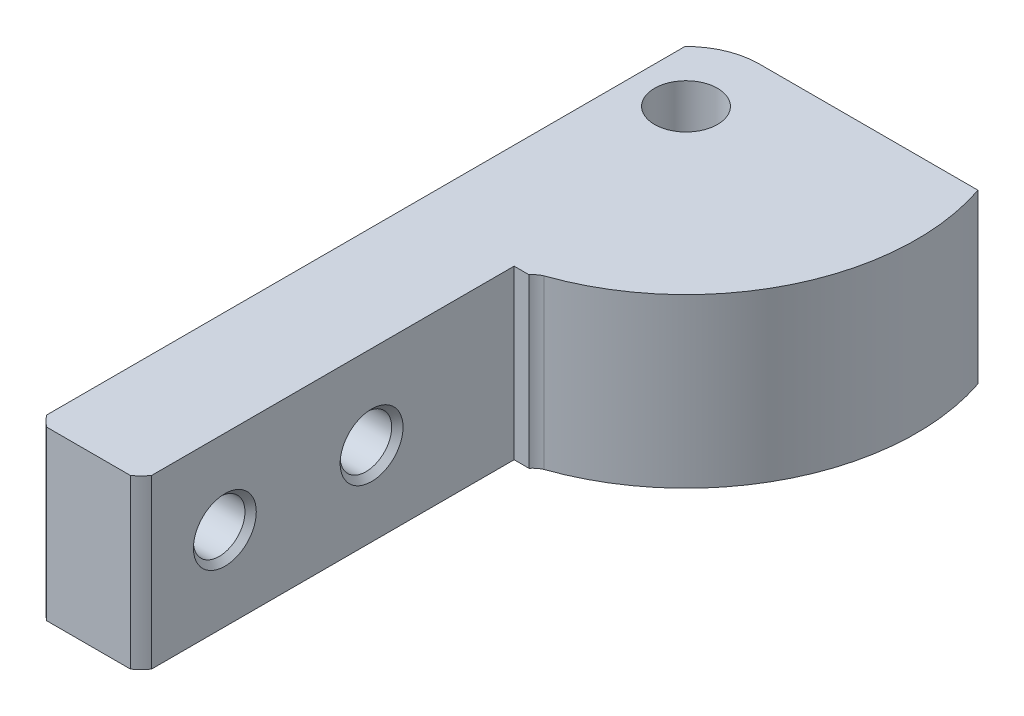
ISO-10303-21;
HEADER;
FILE_DESCRIPTION(('STEP AP214'),'2;1');
FILE_NAME('part.step','',(''),(''),'','','');
FILE_SCHEMA(('AUTOMOTIVE_DESIGN { 1 0 10303 214 1 1 1 1 }'));
ENDSEC;
DATA;
#1=APPLICATION_CONTEXT('core data for automotive mechanical design processes');
#2=APPLICATION_PROTOCOL_DEFINITION('international standard','automotive_design',2000,#1);
#3=PRODUCT_CONTEXT('',#1,'mechanical');
#4=PRODUCT('Part','Part','',(#3));
#5=PRODUCT_RELATED_PRODUCT_CATEGORY('part','',(#4));
#6=PRODUCT_DEFINITION_FORMATION('','',#4);
#7=PRODUCT_DEFINITION_CONTEXT('part definition',#1,'design');
#8=PRODUCT_DEFINITION('design','',#6,#7);
#9=PRODUCT_DEFINITION_SHAPE('','',#8);
#10=(LENGTH_UNIT() NAMED_UNIT(*) SI_UNIT(.MILLI.,.METRE.));
#11=(NAMED_UNIT(*) PLANE_ANGLE_UNIT() SI_UNIT($,.RADIAN.));
#12=(NAMED_UNIT(*) SI_UNIT($,.STERADIAN.) SOLID_ANGLE_UNIT());
#13=UNCERTAINTY_MEASURE_WITH_UNIT(LENGTH_MEASURE(1.E-05),#10,'distance_accuracy_value','');
#14=(GEOMETRIC_REPRESENTATION_CONTEXT(3) GLOBAL_UNCERTAINTY_ASSIGNED_CONTEXT((#13)) GLOBAL_UNIT_ASSIGNED_CONTEXT((#10,
#11,#12)) REPRESENTATION_CONTEXT('',''));
#15=CARTESIAN_POINT('',(0.,0.,0.));
#16=DIRECTION('',(0.,0.,1.));
#17=DIRECTION('',(1.,0.,0.));
#18=AXIS2_PLACEMENT_3D('',#15,#16,#17);
#19=CARTESIAN_POINT('',(3.31307897782906E-10,-4.,-1.11187534873602E-10));
#20=DIRECTION('',(0.,1.,0.));
#21=DIRECTION('',(0.,0.,1.));
#22=AXIS2_PLACEMENT_3D('',#19,#20,#21);
#23=CYLINDRICAL_SURFACE('',#22,3.49999991343765);
#24=CARTESIAN_POINT('',(3.31307897782906E-10,4.,-1.11187534873602E-10));
#25=DIRECTION('',(0.,1.,0.));
#26=DIRECTION('',(0.,0.,1.));
#27=AXIS2_PLACEMENT_3D('',#24,#25,#26);
#28=CIRCLE('',#27,3.49999991343765);
#29=CARTESIAN_POINT('',(3.31307469156537E-10,4.,-3.49999991354884));
#30=VERTEX_POINT('',#29);
#31=CARTESIAN_POINT('',(-2.49999993783827,4.,-2.44948968231352));
#32=VERTEX_POINT('',#31);
#33=EDGE_CURVE('E156',#30,#32,#28,.T.);
#34=ORIENTED_EDGE('',*,*,#33,.F.);
#35=DIRECTION('',(0.,1.,0.));
#36=VECTOR('',#35,1.);
#37=CARTESIAN_POINT('',(3.31307469156537E-10,-4.,-3.49999991354884));
#38=LINE('',#37,#36);
#39=CARTESIAN_POINT('',(3.31307469156537E-10,-4.,-3.49999991354884));
#40=VERTEX_POINT('',#39);
#41=EDGE_CURVE('E61',#40,#30,#38,.T.);
#42=ORIENTED_EDGE('',*,*,#41,.F.);
#43=CARTESIAN_POINT('',(3.31307897782906E-10,-4.,-1.11187534873602E-10));
#44=DIRECTION('',(0.,1.,0.));
#45=DIRECTION('',(0.,0.,1.));
#46=AXIS2_PLACEMENT_3D('',#43,#44,#45);
#47=CIRCLE('',#46,3.49999991343765);
#48=CARTESIAN_POINT('',(-2.49999993783827,-4.,-2.44948968231352));
#49=VERTEX_POINT('',#48);
#50=EDGE_CURVE('E184',#40,#49,#47,.T.);
#51=ORIENTED_EDGE('',*,*,#50,.T.);
#52=DIRECTION('',(0.,1.,0.));
#53=VECTOR('',#52,1.);
#54=CARTESIAN_POINT('',(-2.49999993783827,-4.,-2.44948968231352));
#55=LINE('',#54,#53);
#56=EDGE_CURVE('E108',#49,#32,#55,.T.);
#57=ORIENTED_EDGE('',*,*,#56,.T.);
#58=EDGE_LOOP('',(#34,#42,#51,#57));
#59=FACE_BOUND('',#58,.T.);
#60=ADVANCED_FACE('F43',(#59),#23,.T.);
#61=CARTESIAN_POINT('',(10.4283268363221,-4.,-3.49999991354884));
#62=DIRECTION('',(0.,0.,-1.));
#63=DIRECTION('',(-1.,0.,0.));
#64=AXIS2_PLACEMENT_3D('',#61,#62,#63);
#65=PLANE('',#64);
#66=DIRECTION('',(-1.,0.,0.));
#67=VECTOR('',#66,1.);
#68=CARTESIAN_POINT('',(10.4283268363221,4.,-3.49999991354884));
#69=LINE('',#68,#67);
#70=CARTESIAN_POINT('',(10.4283268363221,4.,-3.49999991354884));
#71=VERTEX_POINT('',#70);
#72=EDGE_CURVE('E181',#71,#30,#69,.T.);
#73=ORIENTED_EDGE('',*,*,#72,.F.);
#74=DIRECTION('',(0.,1.,0.));
#75=VECTOR('',#74,1.);
#76=CARTESIAN_POINT('',(10.4283268363221,-4.,-3.49999991354884));
#77=LINE('',#76,#75);
#78=CARTESIAN_POINT('',(10.4283268363221,-4.,-3.49999991354884));
#79=VERTEX_POINT('',#78);
#80=EDGE_CURVE('E96',#79,#71,#77,.T.);
#81=ORIENTED_EDGE('',*,*,#80,.F.);
#82=DIRECTION('',(-1.,0.,0.));
#83=VECTOR('',#82,1.);
#84=CARTESIAN_POINT('',(10.4283268363221,-4.,-3.49999991354884));
#85=LINE('',#84,#83);
#86=EDGE_CURVE('E146',#79,#40,#85,.T.);
#87=ORIENTED_EDGE('',*,*,#86,.T.);
#88=ORIENTED_EDGE('',*,*,#41,.T.);
#89=EDGE_LOOP('',(#73,#81,#87,#88));
#90=FACE_BOUND('',#89,.T.);
#91=ADVANCED_FACE('F236',(#90),#65,.T.);
#92=CARTESIAN_POINT('',(3.31307897782906E-10,-4.,-1.11187534873602E-10));
#93=DIRECTION('',(0.,1.,0.));
#94=DIRECTION('',(0.,0.,1.));
#95=AXIS2_PLACEMENT_3D('',#92,#93,#94);
#96=CYLINDRICAL_SURFACE('',#95,10.9999999996504);
#97=CARTESIAN_POINT('',(3.31307897782906E-10,4.,-1.11187534873602E-10));
#98=DIRECTION('',(0.,1.,0.));
#99=DIRECTION('',(0.,0.,1.));
#100=AXIS2_PLACEMENT_3D('',#97,#98,#99);
#101=CIRCLE('',#100,10.9999999996504);
#102=CARTESIAN_POINT('',(3.61677906135132,4.,10.3884026305186));
#103=VERTEX_POINT('',#102);
#104=EDGE_CURVE('E133',#103,#71,#101,.T.);
#105=ORIENTED_EDGE('',*,*,#104,.F.);
#106=DIRECTION('',(0.,1.,0.));
#107=VECTOR('',#106,1.);
#108=CARTESIAN_POINT('',(3.61677906135132,-4.,10.3884026305186));
#109=LINE('',#108,#107);
#110=CARTESIAN_POINT('',(3.61677906135132,-4.,10.3884026305186));
#111=VERTEX_POINT('',#110);
#112=EDGE_CURVE('E128',#111,#103,#109,.T.);
#113=ORIENTED_EDGE('',*,*,#112,.F.);
#114=CARTESIAN_POINT('',(3.31307897782906E-10,-4.,-1.11187534873602E-10));
#115=DIRECTION('',(0.,1.,0.));
#116=DIRECTION('',(0.,0.,1.));
#117=AXIS2_PLACEMENT_3D('',#114,#115,#116);
#118=CIRCLE('',#117,10.9999999996504);
#119=EDGE_CURVE('E131',#111,#79,#118,.T.);
#120=ORIENTED_EDGE('',*,*,#119,.T.);
#121=ORIENTED_EDGE('',*,*,#80,.T.);
#122=EDGE_LOOP('',(#105,#113,#120,#121));
#123=FACE_BOUND('',#122,.T.);
#124=ADVANCED_FACE('F130',(#123),#96,.T.);
#125=CARTESIAN_POINT('',(4.00000000044093,-4.,11.3100000002122));
#126=DIRECTION('',(0.,1.,0.));
#127=DIRECTION('',(0.,0.,1.));
#128=AXIS2_PLACEMENT_3D('',#125,#126,#127);
#129=CYLINDRICAL_SURFACE('',#128,0.998098191553737);
#130=CARTESIAN_POINT('',(4.00000000044093,4.,11.3100000002122));
#131=DIRECTION('',(0.,-1.,0.));
#132=DIRECTION('',(0.,0.,-1.));
#133=AXIS2_PLACEMENT_3D('',#130,#131,#132);
#134=CIRCLE('',#133,0.998098191553737);
#135=CARTESIAN_POINT('',(3.21000000044655,4.,10.700000000219));
#136=VERTEX_POINT('',#135);
#137=EDGE_CURVE('E178',#136,#103,#134,.T.);
#138=ORIENTED_EDGE('',*,*,#137,.F.);
#139=DIRECTION('',(0.,1.,0.));
#140=VECTOR('',#139,1.);
#141=CARTESIAN_POINT('',(3.21000000044655,-4.,10.700000000219));
#142=LINE('',#141,#140);
#143=CARTESIAN_POINT('',(3.21000000044655,-4.,10.700000000219));
#144=VERTEX_POINT('',#143);
#145=EDGE_CURVE('E138',#144,#136,#142,.T.);
#146=ORIENTED_EDGE('',*,*,#145,.F.);
#147=CARTESIAN_POINT('',(4.00000000044093,-4.,11.3100000002122));
#148=DIRECTION('',(0.,-1.,0.));
#149=DIRECTION('',(0.,0.,-1.));
#150=AXIS2_PLACEMENT_3D('',#147,#148,#149);
#151=CIRCLE('',#150,0.998098191553737);
#152=EDGE_CURVE('E144',#144,#111,#151,.T.);
#153=ORIENTED_EDGE('',*,*,#152,.T.);
#154=ORIENTED_EDGE('',*,*,#112,.T.);
#155=EDGE_LOOP('',(#138,#146,#153,#154));
#156=FACE_BOUND('',#155,.T.);
#157=ADVANCED_FACE('F148',(#156),#129,.F.);
#158=CARTESIAN_POINT('',(2.50000006930254,-4.,10.700000000219));
#159=DIRECTION('',(0.,0.,1.));
#160=DIRECTION('',(1.,0.,0.));
#161=AXIS2_PLACEMENT_3D('',#158,#159,#160);
#162=PLANE('',#161);
#163=DIRECTION('',(1.,0.,0.));
#164=VECTOR('',#163,1.);
#165=CARTESIAN_POINT('',(2.50000006930254,4.,10.700000000219));
#166=LINE('',#165,#164);
#167=CARTESIAN_POINT('',(2.50000006930254,4.,10.700000000219));
#168=VERTEX_POINT('',#167);
#169=EDGE_CURVE('E175',#168,#136,#166,.T.);
#170=ORIENTED_EDGE('',*,*,#169,.F.);
#171=DIRECTION('',(0.,1.,0.));
#172=VECTOR('',#171,1.);
#173=CARTESIAN_POINT('',(2.50000006930254,-4.,10.700000000219));
#174=LINE('',#173,#172);
#175=CARTESIAN_POINT('',(2.50000006930254,-4.,10.700000000219));
#176=VERTEX_POINT('',#175);
#177=EDGE_CURVE('E189',#176,#168,#174,.T.);
#178=ORIENTED_EDGE('',*,*,#177,.F.);
#179=DIRECTION('',(1.,0.,0.));
#180=VECTOR('',#179,1.);
#181=CARTESIAN_POINT('',(2.50000006930254,-4.,10.700000000219));
#182=LINE('',#181,#180);
#183=EDGE_CURVE('E149',#176,#144,#182,.T.);
#184=ORIENTED_EDGE('',*,*,#183,.T.);
#185=ORIENTED_EDGE('',*,*,#145,.T.);
#186=EDGE_LOOP('',(#170,#178,#184,#185));
#187=FACE_BOUND('',#186,.T.);
#188=ADVANCED_FACE('F292',(#187),#162,.T.);
#189=CARTESIAN_POINT('',(2.50000006930254,-4.,28.0000000580894));
#190=DIRECTION('',(1.,0.,0.));
#191=DIRECTION('',(0.,0.,-1.));
#192=AXIS2_PLACEMENT_3D('',#189,#190,#191);
#193=PLANE('',#192);
#194=CARTESIAN_POINT('',(2.50000006930254,0.,17.5));
#195=DIRECTION('',(1.,0.,0.));
#196=DIRECTION('',(0.,0.,-1.));
#197=AXIS2_PLACEMENT_3D('',#194,#195,#196);
#198=CIRCLE('',#197,1.5);
#199=CARTESIAN_POINT('',(2.50000006930254,0.,16.));
#200=VERTEX_POINT('',#199);
#201=EDGE_CURVE('E208',#200,#200,#198,.F.);
#202=ORIENTED_EDGE('',*,*,#201,.T.);
#203=EDGE_LOOP('',(#202));
#204=FACE_BOUND('',#203,.T.);
#205=CARTESIAN_POINT('',(2.50000006930254,0.,24.5000000010319));
#206=DIRECTION('',(1.,0.,0.));
#207=DIRECTION('',(0.,0.,-1.));
#208=AXIS2_PLACEMENT_3D('',#205,#206,#207);
#209=CIRCLE('',#208,1.49999999999999);
#210=CARTESIAN_POINT('',(2.50000006930254,0.,23.0000000010319));
#211=VERTEX_POINT('',#210);
#212=EDGE_CURVE('E205',#211,#211,#209,.F.);
#213=ORIENTED_EDGE('',*,*,#212,.T.);
#214=EDGE_LOOP('',(#213));
#215=FACE_BOUND('',#214,.T.);
#216=DIRECTION('',(0.,0.,-1.));
#217=VECTOR('',#216,1.);
#218=CARTESIAN_POINT('',(2.50000006930254,4.,28.0000000580894));
#219=LINE('',#218,#217);
#220=CARTESIAN_POINT('',(2.50000006930254,4.,28.0000000580894));
#221=VERTEX_POINT('',#220);
#222=EDGE_CURVE('E172',#221,#168,#219,.T.);
#223=ORIENTED_EDGE('',*,*,#222,.F.);
#224=DIRECTION('',(0.,1.,0.));
#225=VECTOR('',#224,1.);
#226=CARTESIAN_POINT('',(2.50000006930254,-4.,28.0000000580894));
#227=LINE('',#226,#225);
#228=CARTESIAN_POINT('',(2.50000006930254,-4.,28.0000000580894));
#229=VERTEX_POINT('',#228);
#230=EDGE_CURVE('E191',#229,#221,#227,.T.);
#231=ORIENTED_EDGE('',*,*,#230,.F.);
#232=DIRECTION('',(0.,0.,-1.));
#233=VECTOR('',#232,1.);
#234=CARTESIAN_POINT('',(2.50000006930254,-4.,28.0000000580894));
#235=LINE('',#234,#233);
#236=EDGE_CURVE('E151',#229,#176,#235,.T.);
#237=ORIENTED_EDGE('',*,*,#236,.T.);
#238=ORIENTED_EDGE('',*,*,#177,.T.);
#239=EDGE_LOOP('',(#223,#231,#237,#238));
#240=FACE_BOUND('',#239,.T.);
#241=ADVANCED_FACE('F295',(#204,#215,#240),#193,.T.);
#242=CARTESIAN_POINT('',(0.500000062144902,-4.,26.5000000675936));
#243=DIRECTION('',(0.,1.,0.));
#244=DIRECTION('',(0.,0.,1.));
#245=AXIS2_PLACEMENT_3D('',#242,#243,#244);
#246=CYLINDRICAL_SURFACE('',#245,2.50000000002357);
#247=CARTESIAN_POINT('',(0.500000062144902,4.,26.5000000675936));
#248=DIRECTION('',(0.,1.,0.));
#249=DIRECTION('',(0.,0.,1.));
#250=AXIS2_PLACEMENT_3D('',#247,#248,#249);
#251=CIRCLE('',#250,2.50000000002357);
#252=CARTESIAN_POINT('',(2.00000006216173,4.,28.5000000676105));
#253=VERTEX_POINT('',#252);
#254=EDGE_CURVE('E169',#253,#221,#251,.T.);
#255=ORIENTED_EDGE('',*,*,#254,.F.);
#256=DIRECTION('',(0.,1.,0.));
#257=VECTOR('',#256,1.);
#258=CARTESIAN_POINT('',(2.00000006216173,-4.,28.5000000676105));
#259=LINE('',#258,#257);
#260=CARTESIAN_POINT('',(2.00000006216173,-4.,28.5000000676105));
#261=VERTEX_POINT('',#260);
#262=EDGE_CURVE('E193',#261,#253,#259,.T.);
#263=ORIENTED_EDGE('',*,*,#262,.F.);
#264=CARTESIAN_POINT('',(0.500000062144902,-4.,26.5000000675936));
#265=DIRECTION('',(0.,1.,0.));
#266=DIRECTION('',(0.,0.,1.));
#267=AXIS2_PLACEMENT_3D('',#264,#265,#266);
#268=CIRCLE('',#267,2.50000000002357);
#269=EDGE_CURVE('E328',#261,#229,#268,.T.);
#270=ORIENTED_EDGE('',*,*,#269,.T.);
#271=ORIENTED_EDGE('',*,*,#230,.T.);
#272=EDGE_LOOP('',(#255,#263,#270,#271));
#273=FACE_BOUND('',#272,.T.);
#274=ADVANCED_FACE('F299',(#273),#246,.T.);
#275=CARTESIAN_POINT('',(-1.99999992831718,-4.,28.5000000676105));
#276=DIRECTION('',(0.,0.,1.));
#277=DIRECTION('',(1.,0.,0.));
#278=AXIS2_PLACEMENT_3D('',#275,#276,#277);
#279=PLANE('',#278);
#280=DIRECTION('',(1.,0.,0.));
#281=VECTOR('',#280,1.);
#282=CARTESIAN_POINT('',(-1.99999992831718,4.,28.5000000676105));
#283=LINE('',#282,#281);
#284=CARTESIAN_POINT('',(-1.99999992831718,4.,28.5000000676105));
#285=VERTEX_POINT('',#284);
#286=EDGE_CURVE('E166',#285,#253,#283,.T.);
#287=ORIENTED_EDGE('',*,*,#286,.F.);
#288=DIRECTION('',(0.,1.,0.));
#289=VECTOR('',#288,1.);
#290=CARTESIAN_POINT('',(-1.99999992831718,-4.,28.5000000676105));
#291=LINE('',#290,#289);
#292=CARTESIAN_POINT('',(-1.99999992831718,-4.,28.5000000676105));
#293=VERTEX_POINT('',#292);
#294=EDGE_CURVE('E195',#293,#285,#291,.T.);
#295=ORIENTED_EDGE('',*,*,#294,.F.);
#296=DIRECTION('',(1.,0.,0.));
#297=VECTOR('',#296,1.);
#298=CARTESIAN_POINT('',(-1.99999992831718,-4.,28.5000000676105));
#299=LINE('',#298,#297);
#300=EDGE_CURVE('E321',#293,#261,#299,.T.);
#301=ORIENTED_EDGE('',*,*,#300,.T.);
#302=ORIENTED_EDGE('',*,*,#262,.T.);
#303=EDGE_LOOP('',(#287,#295,#301,#302));
#304=FACE_BOUND('',#303,.T.);
#305=ADVANCED_FACE('F303',(#304),#279,.T.);
#306=CARTESIAN_POINT('',(-0.499999937821432,-4.,26.5000000604528));
#307=DIRECTION('',(0.,1.,0.));
#308=DIRECTION('',(0.,0.,1.));
#309=AXIS2_PLACEMENT_3D('',#306,#307,#308);
#310=CYLINDRICAL_SURFACE('',#309,2.50000000002357);
#311=CARTESIAN_POINT('',(-0.499999937821432,4.,26.5000000604528));
#312=DIRECTION('',(0.,1.,0.));
#313=DIRECTION('',(0.,0.,1.));
#314=AXIS2_PLACEMENT_3D('',#311,#312,#313);
#315=CIRCLE('',#314,2.50000000002357);
#316=CARTESIAN_POINT('',(-2.49999993783826,4.,28.0000000604697));
#317=VERTEX_POINT('',#316);
#318=EDGE_CURVE('E163',#317,#285,#315,.T.);
#319=ORIENTED_EDGE('',*,*,#318,.F.);
#320=DIRECTION('',(0.,1.,0.));
#321=VECTOR('',#320,1.);
#322=CARTESIAN_POINT('',(-2.49999993783826,-4.,28.0000000604697));
#323=LINE('',#322,#321);
#324=CARTESIAN_POINT('',(-2.49999993783826,-4.,28.0000000604697));
#325=VERTEX_POINT('',#324);
#326=EDGE_CURVE('E197',#325,#317,#323,.T.);
#327=ORIENTED_EDGE('',*,*,#326,.F.);
#328=CARTESIAN_POINT('',(-0.499999937821432,-4.,26.5000000604528));
#329=DIRECTION('',(0.,1.,0.));
#330=DIRECTION('',(0.,0.,1.));
#331=AXIS2_PLACEMENT_3D('',#328,#329,#330);
#332=CIRCLE('',#331,2.50000000002357);
#333=EDGE_CURVE('E319',#325,#293,#332,.T.);
#334=ORIENTED_EDGE('',*,*,#333,.T.);
#335=ORIENTED_EDGE('',*,*,#294,.T.);
#336=EDGE_LOOP('',(#319,#327,#334,#335));
#337=FACE_BOUND('',#336,.T.);
#338=ADVANCED_FACE('F306',(#337),#310,.T.);
#339=CARTESIAN_POINT('',(-2.49999993783827,-4.,-2.44948968231352));
#340=DIRECTION('',(-1.,0.,0.));
#341=DIRECTION('',(0.,0.,1.));
#342=AXIS2_PLACEMENT_3D('',#339,#340,#341);
#343=PLANE('',#342);
#344=CARTESIAN_POINT('',(-2.49999993783826,0.,24.5000000010319));
#345=DIRECTION('',(-1.,0.,0.));
#346=DIRECTION('',(0.,0.,1.));
#347=AXIS2_PLACEMENT_3D('',#344,#345,#346);
#348=CIRCLE('',#347,1.5);
#349=CARTESIAN_POINT('',(-2.49999993783826,0.,26.0000000010319));
#350=VERTEX_POINT('',#349);
#351=EDGE_CURVE('E214',#350,#350,#348,.F.);
#352=ORIENTED_EDGE('',*,*,#351,.T.);
#353=EDGE_LOOP('',(#352));
#354=FACE_BOUND('',#353,.T.);
#355=CARTESIAN_POINT('',(-2.49999993783826,0.,17.5));
#356=DIRECTION('',(-1.,0.,0.));
#357=DIRECTION('',(0.,0.,1.));
#358=AXIS2_PLACEMENT_3D('',#355,#356,#357);
#359=CIRCLE('',#358,1.49999999999999);
#360=CARTESIAN_POINT('',(-2.49999993783826,0.,19.));
#361=VERTEX_POINT('',#360);
#362=EDGE_CURVE('E211',#361,#361,#359,.F.);
#363=ORIENTED_EDGE('',*,*,#362,.T.);
#364=EDGE_LOOP('',(#363));
#365=FACE_BOUND('',#364,.T.);
#366=DIRECTION('',(0.,0.,1.));
#367=VECTOR('',#366,1.);
#368=CARTESIAN_POINT('',(-2.49999993783827,4.,-2.44948968231352));
#369=LINE('',#368,#367);
#370=EDGE_CURVE('E159',#32,#317,#369,.T.);
#371=ORIENTED_EDGE('',*,*,#370,.F.);
#372=ORIENTED_EDGE('',*,*,#56,.F.);
#373=DIRECTION('',(0.,0.,1.));
#374=VECTOR('',#373,1.);
#375=CARTESIAN_POINT('',(-2.49999993783827,-4.,-2.44948968231352));
#376=LINE('',#375,#374);
#377=EDGE_CURVE('E318',#49,#325,#376,.T.);
#378=ORIENTED_EDGE('',*,*,#377,.T.);
#379=ORIENTED_EDGE('',*,*,#326,.T.);
#380=EDGE_LOOP('',(#371,#372,#378,#379));
#381=FACE_BOUND('',#380,.T.);
#382=ADVANCED_FACE('F244',(#354,#365,#381),#343,.T.);
#383=CARTESIAN_POINT('',(3.31307897782906E-10,-4.,-1.11187534873602E-10));
#384=DIRECTION('',(0.,1.,0.));
#385=DIRECTION('',(0.,0.,1.));
#386=AXIS2_PLACEMENT_3D('',#383,#384,#385);
#387=PLANE('',#386);
#388=CARTESIAN_POINT('',(0.,-4.00000000000001,0.));
#389=DIRECTION('',(0.,1.,0.));
#390=DIRECTION('',(0.,0.,1.));
#391=AXIS2_PLACEMENT_3D('',#388,#389,#390);
#392=CIRCLE('',#391,1.49999999999999);
#393=CARTESIAN_POINT('',(0.,-4.00000000000001,1.49999999999999));
#394=VERTEX_POINT('',#393);
#395=EDGE_CURVE('E160',#394,#394,#392,.T.);
#396=ORIENTED_EDGE('',*,*,#395,.T.);
#397=EDGE_LOOP('',(#396));
#398=FACE_BOUND('',#397,.T.);
#399=ORIENTED_EDGE('',*,*,#50,.F.);
#400=ORIENTED_EDGE('',*,*,#86,.F.);
#401=ORIENTED_EDGE('',*,*,#119,.F.);
#402=ORIENTED_EDGE('',*,*,#152,.F.);
#403=ORIENTED_EDGE('',*,*,#183,.F.);
#404=ORIENTED_EDGE('',*,*,#236,.F.);
#405=ORIENTED_EDGE('',*,*,#269,.F.);
#406=ORIENTED_EDGE('',*,*,#300,.F.);
#407=ORIENTED_EDGE('',*,*,#333,.F.);
#408=ORIENTED_EDGE('',*,*,#377,.F.);
#409=EDGE_LOOP('',(#399,#400,#401,#402,#403,#404,#405,#406,#407,#408));
#410=FACE_BOUND('',#409,.T.);
#411=ADVANCED_FACE('F142',(#398,#410),#387,.F.);
#412=CARTESIAN_POINT('',(3.31307897782906E-10,4.,-1.11187534873602E-10));
#413=DIRECTION('',(0.,1.,0.));
#414=DIRECTION('',(0.,0.,1.));
#415=AXIS2_PLACEMENT_3D('',#412,#413,#414);
#416=PLANE('',#415);
#417=CARTESIAN_POINT('',(0.,4.,0.));
#418=DIRECTION('',(0.,1.,0.));
#419=DIRECTION('',(0.,0.,1.));
#420=AXIS2_PLACEMENT_3D('',#417,#418,#419);
#421=CIRCLE('',#420,1.49999999999999);
#422=CARTESIAN_POINT('',(0.,4.,1.49999999999999));
#423=VERTEX_POINT('',#422);
#424=EDGE_CURVE('E340',#423,#423,#421,.T.);
#425=ORIENTED_EDGE('',*,*,#424,.F.);
#426=EDGE_LOOP('',(#425));
#427=FACE_BOUND('',#426,.T.);
#428=ORIENTED_EDGE('',*,*,#33,.T.);
#429=ORIENTED_EDGE('',*,*,#370,.T.);
#430=ORIENTED_EDGE('',*,*,#318,.T.);
#431=ORIENTED_EDGE('',*,*,#286,.T.);
#432=ORIENTED_EDGE('',*,*,#254,.T.);
#433=ORIENTED_EDGE('',*,*,#222,.T.);
#434=ORIENTED_EDGE('',*,*,#169,.T.);
#435=ORIENTED_EDGE('',*,*,#137,.T.);
#436=ORIENTED_EDGE('',*,*,#104,.T.);
#437=ORIENTED_EDGE('',*,*,#72,.T.);
#438=EDGE_LOOP('',(#428,#429,#430,#431,#432,#433,#434,#435,#436,#437));
#439=FACE_BOUND('',#438,.T.);
#440=ADVANCED_FACE('F272',(#427,#439),#416,.T.);
#441=CARTESIAN_POINT('',(-2.49999993783826,0.,17.5));
#442=DIRECTION('',(-1.,0.,0.));
#443=DIRECTION('',(0.,0.,1.));
#444=AXIS2_PLACEMENT_3D('',#441,#442,#443);
#445=CYLINDRICAL_SURFACE('',#444,1.22949999999999);
#446=CARTESIAN_POINT('',(2.22950006930254,0.,17.5));
#447=DIRECTION('',(1.,0.,0.));
#448=DIRECTION('',(0.,0.,-1.));
#449=AXIS2_PLACEMENT_3D('',#446,#447,#448);
#450=CIRCLE('',#449,1.22949999999999);
#451=CARTESIAN_POINT('',(2.22950006930254,0.,16.2705));
#452=VERTEX_POINT('',#451);
#453=EDGE_CURVE('E202',#452,#452,#450,.T.);
#454=ORIENTED_EDGE('',*,*,#453,.T.);
#455=EDGE_LOOP('',(#454));
#456=FACE_BOUND('',#455,.T.);
#457=CARTESIAN_POINT('',(-2.22949993783827,0.,17.5));
#458=DIRECTION('',(-1.,0.,0.));
#459=DIRECTION('',(0.,0.,1.));
#460=AXIS2_PLACEMENT_3D('',#457,#458,#459);
#461=CIRCLE('',#460,1.22949999999999);
#462=CARTESIAN_POINT('',(-2.22949993783827,0.,18.7295));
#463=VERTEX_POINT('',#462);
#464=EDGE_CURVE('E186',#463,#463,#461,.T.);
#465=ORIENTED_EDGE('',*,*,#464,.T.);
#466=EDGE_LOOP('',(#465));
#467=FACE_BOUND('',#466,.T.);
#468=ADVANCED_FACE('F269',(#456,#467),#445,.F.);
#469=CARTESIAN_POINT('',(2.50000006930254,0.,24.5000000010319));
#470=DIRECTION('',(1.,0.,0.));
#471=DIRECTION('',(0.,0.,-1.));
#472=AXIS2_PLACEMENT_3D('',#469,#470,#471);
#473=CYLINDRICAL_SURFACE('',#472,1.22949999999999);
#474=CARTESIAN_POINT('',(-2.22949993783826,0.,24.5000000010319));
#475=DIRECTION('',(-1.,0.,0.));
#476=DIRECTION('',(0.,0.,1.));
#477=AXIS2_PLACEMENT_3D('',#474,#475,#476);
#478=CIRCLE('',#477,1.22949999999999);
#479=CARTESIAN_POINT('',(-2.22949993783826,0.,25.7295000010319));
#480=VERTEX_POINT('',#479);
#481=EDGE_CURVE('E11',#480,#480,#478,.T.);
#482=ORIENTED_EDGE('',*,*,#481,.T.);
#483=EDGE_LOOP('',(#482));
#484=FACE_BOUND('',#483,.T.);
#485=CARTESIAN_POINT('',(2.22950006930255,0.,24.5000000010319));
#486=DIRECTION('',(1.,0.,0.));
#487=DIRECTION('',(0.,0.,-1.));
#488=AXIS2_PLACEMENT_3D('',#485,#486,#487);
#489=CIRCLE('',#488,1.22949999999999);
#490=CARTESIAN_POINT('',(2.22950006930255,0.,23.2705000010319));
#491=VERTEX_POINT('',#490);
#492=EDGE_CURVE('E53',#491,#491,#489,.T.);
#493=ORIENTED_EDGE('',*,*,#492,.T.);
#494=EDGE_LOOP('',(#493));
#495=FACE_BOUND('',#494,.T.);
#496=ADVANCED_FACE('F219',(#484,#495),#473,.F.);
#497=CARTESIAN_POINT('',(0.,4.,0.));
#498=DIRECTION('',(0.,1.,0.));
#499=DIRECTION('',(0.,0.,1.));
#500=AXIS2_PLACEMENT_3D('',#497,#498,#499);
#501=CYLINDRICAL_SURFACE('',#500,1.49999999999999);
#502=ORIENTED_EDGE('',*,*,#395,.F.);
#503=EDGE_LOOP('',(#502));
#504=FACE_BOUND('',#503,.T.);
#505=ORIENTED_EDGE('',*,*,#424,.T.);
#506=EDGE_LOOP('',(#505));
#507=FACE_BOUND('',#506,.T.);
#508=ADVANCED_FACE('F251',(#504,#507),#501,.F.);
#509=CARTESIAN_POINT('',(2.22950006930254,0.,17.5));
#510=DIRECTION('',(1.,0.,0.));
#511=DIRECTION('',(0.,0.,-1.));
#512=AXIS2_PLACEMENT_3D('',#509,#510,#511);
#513=CONICAL_SURFACE('',#512,1.22949999999999,0.785398163397444);
#514=ORIENTED_EDGE('',*,*,#201,.F.);
#515=EDGE_LOOP('',(#514));
#516=FACE_BOUND('',#515,.T.);
#517=ORIENTED_EDGE('',*,*,#453,.F.);
#518=EDGE_LOOP('',(#517));
#519=FACE_BOUND('',#518,.T.);
#520=ADVANCED_FACE('F230',(#516,#519),#513,.F.);
#521=CARTESIAN_POINT('',(-2.49999993783826,0.,24.5000000010319));
#522=DIRECTION('',(-1.,0.,0.));
#523=DIRECTION('',(0.,0.,1.));
#524=AXIS2_PLACEMENT_3D('',#521,#522,#523);
#525=CONICAL_SURFACE('',#524,1.5,0.785398163397451);
#526=ORIENTED_EDGE('',*,*,#481,.F.);
#527=EDGE_LOOP('',(#526));
#528=FACE_BOUND('',#527,.T.);
#529=ORIENTED_EDGE('',*,*,#351,.F.);
#530=EDGE_LOOP('',(#529));
#531=FACE_BOUND('',#530,.T.);
#532=ADVANCED_FACE('F223',(#528,#531),#525,.F.);
#533=CARTESIAN_POINT('',(2.22950006930255,0.,24.5000000010319));
#534=DIRECTION('',(1.,0.,0.));
#535=DIRECTION('',(0.,0.,-1.));
#536=AXIS2_PLACEMENT_3D('',#533,#534,#535);
#537=CONICAL_SURFACE('',#536,1.22949999999999,0.785398163397444);
#538=ORIENTED_EDGE('',*,*,#212,.F.);
#539=EDGE_LOOP('',(#538));
#540=FACE_BOUND('',#539,.T.);
#541=ORIENTED_EDGE('',*,*,#492,.F.);
#542=EDGE_LOOP('',(#541));
#543=FACE_BOUND('',#542,.T.);
#544=ADVANCED_FACE('F221',(#540,#543),#537,.F.);
#545=CARTESIAN_POINT('',(-2.22949993783827,0.,17.5));
#546=DIRECTION('',(-1.,0.,0.));
#547=DIRECTION('',(0.,0.,1.));
#548=AXIS2_PLACEMENT_3D('',#545,#546,#547);
#549=CONICAL_SURFACE('',#548,1.22949999999999,0.785398163397444);
#550=CARTESIAN_POINT('',(-2.49999993783826,0.,19.));
#551=CARTESIAN_POINT('',(-2.49718222950493,0.,18.9971822916667));
#552=CARTESIAN_POINT('',(-2.4943645211716,0.,18.9943645833333));
#553=CARTESIAN_POINT('',(-2.48872910450493,0.,18.9887291666667));
#554=CARTESIAN_POINT('',(-2.4859113961716,0.,18.9859114583333));
#555=CARTESIAN_POINT('',(-2.48027597950493,0.,18.9802760416667));
#556=CARTESIAN_POINT('',(-2.4774582711716,0.,18.9774583333333));
#557=CARTESIAN_POINT('',(-2.47182285450493,0.,18.9718229166667));
#558=CARTESIAN_POINT('',(-2.4690051461716,0.,18.9690052083333));
#559=CARTESIAN_POINT('',(-2.46336972950493,0.,18.9633697916667));
#560=CARTESIAN_POINT('',(-2.4605520211716,0.,18.9605520833333));
#561=CARTESIAN_POINT('',(-2.45491660450493,0.,18.9549166666667));
#562=CARTESIAN_POINT('',(-2.4520988961716,0.,18.9520989583333));
#563=CARTESIAN_POINT('',(-2.44646347950493,0.,18.9464635416667));
#564=CARTESIAN_POINT('',(-2.4436457711716,0.,18.9436458333333));
#565=CARTESIAN_POINT('',(-2.43801035450493,0.,18.9380104166667));
#566=CARTESIAN_POINT('',(-2.4351926461716,0.,18.9351927083333));
#567=CARTESIAN_POINT('',(-2.42955722950493,0.,18.9295572916667));
#568=CARTESIAN_POINT('',(-2.4267395211716,0.,18.9267395833333));
#569=CARTESIAN_POINT('',(-2.42110410450493,0.,18.9211041666667));
#570=CARTESIAN_POINT('',(-2.4182863961716,0.,18.9182864583333));
#571=CARTESIAN_POINT('',(-2.41265097950493,0.,18.9126510416667));
#572=CARTESIAN_POINT('',(-2.4098332711716,0.,18.9098333333333));
#573=CARTESIAN_POINT('',(-2.40419785450493,0.,18.9041979166667));
#574=CARTESIAN_POINT('',(-2.4013801461716,0.,18.9013802083333));
#575=CARTESIAN_POINT('',(-2.39574472950493,0.,18.8957447916667));
#576=CARTESIAN_POINT('',(-2.3929270211716,0.,18.8929270833333));
#577=CARTESIAN_POINT('',(-2.38729160450493,0.,18.8872916666667));
#578=CARTESIAN_POINT('',(-2.3844738961716,0.,18.8844739583333));
#579=CARTESIAN_POINT('',(-2.37883847950493,0.,18.8788385416667));
#580=CARTESIAN_POINT('',(-2.3760207711716,0.,18.8760208333333));
#581=CARTESIAN_POINT('',(-2.37038535450493,0.,18.8703854166667));
#582=CARTESIAN_POINT('',(-2.3675676461716,0.,18.8675677083333));
#583=CARTESIAN_POINT('',(-2.36193222950493,0.,18.8619322916667));
#584=CARTESIAN_POINT('',(-2.3591145211716,0.,18.8591145833333));
#585=CARTESIAN_POINT('',(-2.35347910450493,0.,18.8534791666667));
#586=CARTESIAN_POINT('',(-2.3506613961716,0.,18.8506614583333));
#587=CARTESIAN_POINT('',(-2.34502597950493,0.,18.8450260416667));
#588=CARTESIAN_POINT('',(-2.3422082711716,0.,18.8422083333333));
#589=CARTESIAN_POINT('',(-2.33657285450493,0.,18.8365729166667));
#590=CARTESIAN_POINT('',(-2.3337551461716,0.,18.8337552083333));
#591=CARTESIAN_POINT('',(-2.32811972950493,0.,18.8281197916667));
#592=CARTESIAN_POINT('',(-2.3253020211716,0.,18.8253020833333));
#593=CARTESIAN_POINT('',(-2.31966660450493,0.,18.8196666666667));
#594=CARTESIAN_POINT('',(-2.3168488961716,0.,18.8168489583333));
#595=CARTESIAN_POINT('',(-2.31121347950493,0.,18.8112135416667));
#596=CARTESIAN_POINT('',(-2.3083957711716,0.,18.8083958333333));
#597=CARTESIAN_POINT('',(-2.30276035450493,0.,18.8027604166667));
#598=CARTESIAN_POINT('',(-2.2999426461716,0.,18.7999427083333));
#599=CARTESIAN_POINT('',(-2.29430722950493,0.,18.7943072916667));
#600=CARTESIAN_POINT('',(-2.2914895211716,0.,18.7914895833333));
#601=CARTESIAN_POINT('',(-2.28585410450493,0.,18.7858541666667));
#602=CARTESIAN_POINT('',(-2.2830363961716,0.,18.7830364583333));
#603=CARTESIAN_POINT('',(-2.27740097950493,0.,18.7774010416667));
#604=CARTESIAN_POINT('',(-2.2745832711716,0.,18.7745833333333));
#605=CARTESIAN_POINT('',(-2.26894785450493,0.,18.7689479166667));
#606=CARTESIAN_POINT('',(-2.2661301461716,0.,18.7661302083333));
#607=CARTESIAN_POINT('',(-2.26049472950493,0.,18.7604947916667));
#608=CARTESIAN_POINT('',(-2.2576770211716,0.,18.7576770833333));
#609=CARTESIAN_POINT('',(-2.25204160450493,0.,18.7520416666667));
#610=CARTESIAN_POINT('',(-2.2492238961716,0.,18.7492239583333));
#611=CARTESIAN_POINT('',(-2.24358847950493,0.,18.7435885416667));
#612=CARTESIAN_POINT('',(-2.2407707711716,0.,18.7407708333333));
#613=CARTESIAN_POINT('',(-2.23513535450493,0.,18.7351354166667));
#614=CARTESIAN_POINT('',(-2.2323176461716,0.,18.7323177083333));
#615=CARTESIAN_POINT('',(-2.22949993783827,0.,18.7295));
#616=B_SPLINE_CURVE_WITH_KNOTS('',3,(#550,#551,#552,#553,#554,#555,#556,#557,#558,#559,#560,
#561,#562,#563,#564,#565,#566,#567,#568,#569,#570,#571,#572,#573,#574,#575,#576,#577,#578,#579,
#580,#581,#582,#583,#584,#585,#586,#587,#588,#589,#590,#591,#592,#593,#594,#595,#596,#597,#598,
#599,#600,#601,#602,#603,#604,#605,#606,#607,#608,#609,#610,#611,#612,#613,#614,#615),
.UNSPECIFIED.,.F.,.F.,(4,2,2,2,2,2,2,2,2,2,2,2,2,2,2,2,2,2,2,2,2,2,2,2,2,2,2,2,2,2,2,2,4),(0.,
0.0119545240194338,0.0239090480388701,0.035863572058304,0.0478180960777406,0.0597726200971744,
0.0717271441166082,0.0836816681360445,0.0956361921554787,0.107590716174913,0.119545240194349,
0.131499764213783,0.143454288233219,0.155408812252653,0.167363336272087,0.179317860291523,
0.191272384310957,0.203226908330394,0.215181432349827,0.227135956369261,0.239090480388698,
0.251045004408132,0.262999528427566,0.274954052447002,0.286908576466436,0.298863100485872,
0.310817624505306,0.32277214852474,0.334726672544177,0.346681196563611,0.358635720583047,
0.370590244602481,0.382544768621915),.UNSPECIFIED.);
#617=EDGE_CURVE('BSEAM46',#361,#463,#616,.T.);
#618=ORIENTED_EDGE('',*,*,#362,.F.);
#619=ORIENTED_EDGE('',*,*,#464,.F.);
#620=ORIENTED_EDGE('',*,*,#617,.T.);
#621=ORIENTED_EDGE('',*,*,#617,.F.);
#622=EDGE_LOOP('',(#618,#620,#619,#621));
#623=FACE_BOUND('',#622,.T.);
#624=ADVANCED_FACE('F46',(#623),#549,.F.);
#625=CLOSED_SHELL('',(#60,#91,#124,#157,#188,#241,#274,#305,#338,#382,#411,#440,#468,#496,#508,
#520,#532,#544,#624));
#626=MANIFOLD_SOLID_BREP('B2',#625);
#627=ADVANCED_BREP_SHAPE_REPRESENTATION('',(#18,#626),#14);
#628=SHAPE_DEFINITION_REPRESENTATION(#9,#627);
ENDSEC;
END-ISO-10303-21;
